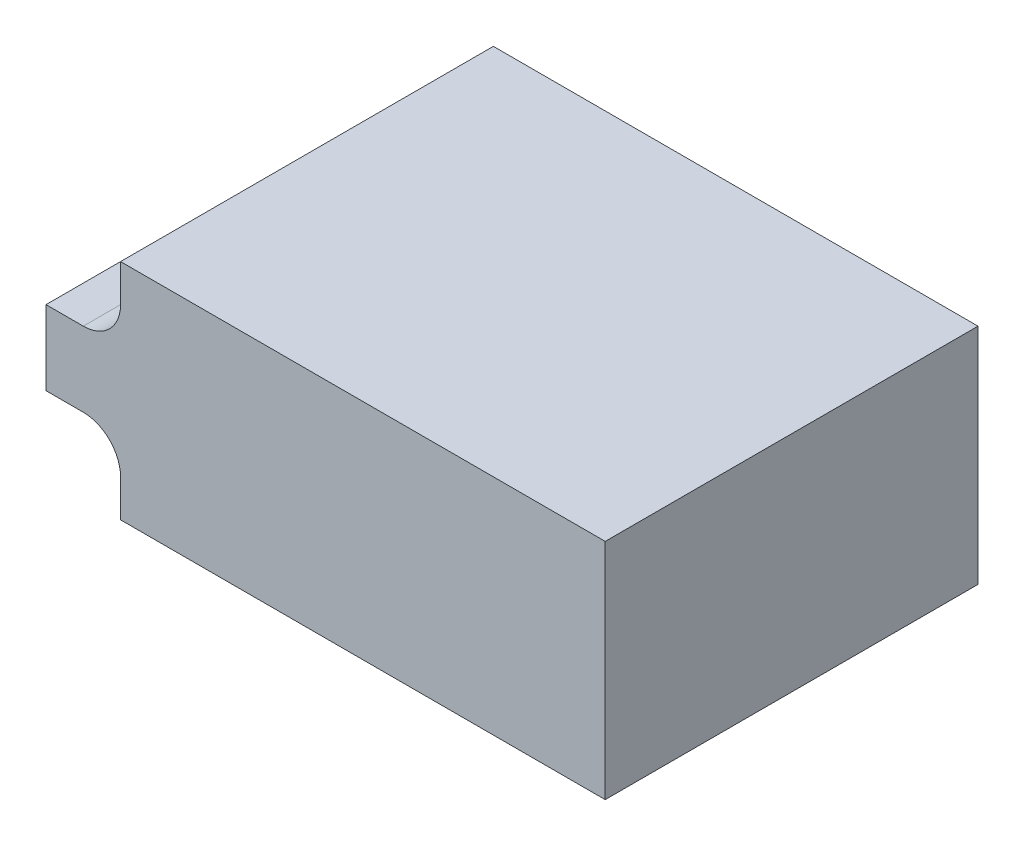
ISO-10303-21;
HEADER;
FILE_DESCRIPTION(('STEP AP214'),'2;1');
FILE_NAME('part.step','',(''),(''),'','','');
FILE_SCHEMA(('AUTOMOTIVE_DESIGN { 1 0 10303 214 1 1 1 1 }'));
ENDSEC;
DATA;
#1=APPLICATION_CONTEXT('core data for automotive mechanical design processes');
#2=APPLICATION_PROTOCOL_DEFINITION('international standard','automotive_design',2000,#1);
#3=PRODUCT_CONTEXT('',#1,'mechanical');
#4=PRODUCT('Part','Part','',(#3));
#5=PRODUCT_RELATED_PRODUCT_CATEGORY('part','',(#4));
#6=PRODUCT_DEFINITION_FORMATION('','',#4);
#7=PRODUCT_DEFINITION_CONTEXT('part definition',#1,'design');
#8=PRODUCT_DEFINITION('design','',#6,#7);
#9=PRODUCT_DEFINITION_SHAPE('','',#8);
#10=(LENGTH_UNIT() NAMED_UNIT(*) SI_UNIT(.MILLI.,.METRE.));
#11=(NAMED_UNIT(*) PLANE_ANGLE_UNIT() SI_UNIT($,.RADIAN.));
#12=(NAMED_UNIT(*) SI_UNIT($,.STERADIAN.) SOLID_ANGLE_UNIT());
#13=UNCERTAINTY_MEASURE_WITH_UNIT(LENGTH_MEASURE(1.E-05),#10,'distance_accuracy_value','');
#14=(GEOMETRIC_REPRESENTATION_CONTEXT(3) GLOBAL_UNCERTAINTY_ASSIGNED_CONTEXT((#13)) GLOBAL_UNIT_ASSIGNED_CONTEXT((#10,
#11,#12)) REPRESENTATION_CONTEXT('',''));
#15=CARTESIAN_POINT('',(0.,0.,0.));
#16=DIRECTION('',(0.,0.,1.));
#17=DIRECTION('',(1.,0.,0.));
#18=AXIS2_PLACEMENT_3D('',#15,#16,#17);
#19=CARTESIAN_POINT('',(7.5,3.,10.));
#20=DIRECTION('',(-1.,0.,0.));
#21=DIRECTION('',(0.,-1.,0.));
#22=AXIS2_PLACEMENT_3D('',#19,#20,#21);
#23=PLANE('',#22);
#24=DIRECTION('',(0.,1.,0.));
#25=VECTOR('',#24,1.);
#26=CARTESIAN_POINT('',(7.5,3.,0.));
#27=LINE('',#26,#25);
#28=CARTESIAN_POINT('',(7.5,-3.,0.));
#29=VERTEX_POINT('',#28);
#30=CARTESIAN_POINT('',(7.5,3.,0.));
#31=VERTEX_POINT('',#30);
#32=EDGE_CURVE('E152',#29,#31,#27,.T.);
#33=ORIENTED_EDGE('',*,*,#32,.T.);
#34=DIRECTION('',(0.,0.,-1.));
#35=VECTOR('',#34,1.);
#36=CARTESIAN_POINT('',(7.5,3.,10.));
#37=LINE('',#36,#35);
#38=CARTESIAN_POINT('',(7.5,3.,10.));
#39=VERTEX_POINT('',#38);
#40=EDGE_CURVE('E167',#39,#31,#37,.T.);
#41=ORIENTED_EDGE('',*,*,#40,.F.);
#42=DIRECTION('',(0.,1.,0.));
#43=VECTOR('',#42,1.);
#44=CARTESIAN_POINT('',(7.5,3.,10.));
#45=LINE('',#44,#43);
#46=CARTESIAN_POINT('',(7.5,-3.,10.));
#47=VERTEX_POINT('',#46);
#48=EDGE_CURVE('E135',#47,#39,#45,.T.);
#49=ORIENTED_EDGE('',*,*,#48,.F.);
#50=DIRECTION('',(0.,0.,-1.));
#51=VECTOR('',#50,1.);
#52=CARTESIAN_POINT('',(7.5,-3.,10.));
#53=LINE('',#52,#51);
#54=EDGE_CURVE('E151',#47,#29,#53,.T.);
#55=ORIENTED_EDGE('',*,*,#54,.T.);
#56=EDGE_LOOP('',(#33,#41,#49,#55));
#57=FACE_BOUND('',#56,.T.);
#58=ADVANCED_FACE('F38',(#57),#23,.F.);
#59=CARTESIAN_POINT('',(-7.5,3.,10.));
#60=DIRECTION('',(0.,-1.,0.));
#61=DIRECTION('',(0.,0.,-1.));
#62=AXIS2_PLACEMENT_3D('',#59,#60,#61);
#63=PLANE('',#62);
#64=DIRECTION('',(-1.,0.,0.));
#65=VECTOR('',#64,1.);
#66=CARTESIAN_POINT('',(-7.5,3.,0.));
#67=LINE('',#66,#65);
#68=CARTESIAN_POINT('',(-5.5,3.,0.));
#69=VERTEX_POINT('',#68);
#70=EDGE_CURVE('E129',#31,#69,#67,.T.);
#71=ORIENTED_EDGE('',*,*,#70,.T.);
#72=DIRECTION('',(0.,0.,-1.));
#73=VECTOR('',#72,1.);
#74=CARTESIAN_POINT('',(-5.5,3.,10.));
#75=LINE('',#74,#73);
#76=CARTESIAN_POINT('',(-5.5,3.,10.));
#77=VERTEX_POINT('',#76);
#78=EDGE_CURVE('E115',#77,#69,#75,.T.);
#79=ORIENTED_EDGE('',*,*,#78,.F.);
#80=DIRECTION('',(-1.,0.,0.));
#81=VECTOR('',#80,1.);
#82=CARTESIAN_POINT('',(-7.5,3.,10.));
#83=LINE('',#82,#81);
#84=EDGE_CURVE('E127',#39,#77,#83,.T.);
#85=ORIENTED_EDGE('',*,*,#84,.F.);
#86=ORIENTED_EDGE('',*,*,#40,.T.);
#87=EDGE_LOOP('',(#71,#79,#85,#86));
#88=FACE_BOUND('',#87,.T.);
#89=ADVANCED_FACE('F125',(#88),#63,.F.);
#90=CARTESIAN_POINT('',(-7.5,3.,10.));
#91=DIRECTION('',(1.,0.,0.));
#92=DIRECTION('',(0.,1.,0.));
#93=AXIS2_PLACEMENT_3D('',#90,#91,#92);
#94=PLANE('',#93);
#95=DIRECTION('',(0.,-1.,0.));
#96=VECTOR('',#95,1.);
#97=CARTESIAN_POINT('',(-7.5,3.,10.));
#98=LINE('',#97,#96);
#99=CARTESIAN_POINT('',(-7.5,0.999999999999999,10.));
#100=VERTEX_POINT('',#99);
#101=CARTESIAN_POINT('',(-7.5,-1.,10.));
#102=VERTEX_POINT('',#101);
#103=EDGE_CURVE('E138',#100,#102,#98,.T.);
#104=ORIENTED_EDGE('',*,*,#103,.F.);
#105=DIRECTION('',(0.,0.,-1.));
#106=VECTOR('',#105,1.);
#107=CARTESIAN_POINT('',(-7.5,0.999999999999999,10.));
#108=LINE('',#107,#106);
#109=CARTESIAN_POINT('',(-7.5,0.999999999999999,0.));
#110=VERTEX_POINT('',#109);
#111=EDGE_CURVE('E131',#100,#110,#108,.T.);
#112=ORIENTED_EDGE('',*,*,#111,.T.);
#113=DIRECTION('',(0.,-1.,0.));
#114=VECTOR('',#113,1.);
#115=CARTESIAN_POINT('',(-7.5,3.,0.));
#116=LINE('',#115,#114);
#117=CARTESIAN_POINT('',(-7.5,-1.,0.));
#118=VERTEX_POINT('',#117);
#119=EDGE_CURVE('E158',#110,#118,#116,.T.);
#120=ORIENTED_EDGE('',*,*,#119,.T.);
#121=DIRECTION('',(0.,0.,-1.));
#122=VECTOR('',#121,1.);
#123=CARTESIAN_POINT('',(-7.5,-1.,10.));
#124=LINE('',#123,#122);
#125=EDGE_CURVE('E205',#102,#118,#124,.T.);
#126=ORIENTED_EDGE('',*,*,#125,.F.);
#127=EDGE_LOOP('',(#104,#112,#120,#126));
#128=FACE_BOUND('',#127,.T.);
#129=ADVANCED_FACE('F244',(#128),#94,.F.);
#130=CARTESIAN_POINT('',(-7.5,-3.,10.));
#131=DIRECTION('',(0.,1.,0.));
#132=DIRECTION('',(0.,0.,1.));
#133=AXIS2_PLACEMENT_3D('',#130,#131,#132);
#134=PLANE('',#133);
#135=DIRECTION('',(1.,0.,0.));
#136=VECTOR('',#135,1.);
#137=CARTESIAN_POINT('',(-7.5,-3.,10.));
#138=LINE('',#137,#136);
#139=CARTESIAN_POINT('',(-5.5,-3.,10.));
#140=VERTEX_POINT('',#139);
#141=EDGE_CURVE('E143',#140,#47,#138,.T.);
#142=ORIENTED_EDGE('',*,*,#141,.F.);
#143=DIRECTION('',(0.,0.,-1.));
#144=VECTOR('',#143,1.);
#145=CARTESIAN_POINT('',(-5.5,-3.,10.));
#146=LINE('',#145,#144);
#147=CARTESIAN_POINT('',(-5.5,-3.,0.));
#148=VERTEX_POINT('',#147);
#149=EDGE_CURVE('E202',#140,#148,#146,.T.);
#150=ORIENTED_EDGE('',*,*,#149,.T.);
#151=DIRECTION('',(1.,0.,0.));
#152=VECTOR('',#151,1.);
#153=CARTESIAN_POINT('',(-7.5,-3.,0.));
#154=LINE('',#153,#152);
#155=EDGE_CURVE('E145',#148,#29,#154,.T.);
#156=ORIENTED_EDGE('',*,*,#155,.T.);
#157=ORIENTED_EDGE('',*,*,#54,.F.);
#158=EDGE_LOOP('',(#142,#150,#156,#157));
#159=FACE_BOUND('',#158,.T.);
#160=ADVANCED_FACE('F246',(#159),#134,.F.);
#161=CARTESIAN_POINT('',(0.,0.,10.));
#162=DIRECTION('',(0.,0.,1.));
#163=DIRECTION('',(1.,0.,0.));
#164=AXIS2_PLACEMENT_3D('',#161,#162,#163);
#165=PLANE('',#164);
#166=DIRECTION('',(0.,-1.,0.));
#167=VECTOR('',#166,1.);
#168=CARTESIAN_POINT('',(-5.5,3.,10.));
#169=LINE('',#168,#167);
#170=CARTESIAN_POINT('',(-5.5,2.,10.));
#171=VERTEX_POINT('',#170);
#172=EDGE_CURVE('E112',#77,#171,#169,.T.);
#173=ORIENTED_EDGE('',*,*,#172,.T.);
#174=CARTESIAN_POINT('',(-6.5,2.,10.));
#175=DIRECTION('',(0.,0.,1.));
#176=DIRECTION('',(1.,0.,0.));
#177=AXIS2_PLACEMENT_3D('',#174,#175,#176);
#178=CIRCLE('',#177,1.);
#179=CARTESIAN_POINT('',(-6.5,0.999999999999999,10.));
#180=VERTEX_POINT('',#179);
#181=EDGE_CURVE('E11',#171,#180,#178,.F.);
#182=ORIENTED_EDGE('',*,*,#181,.T.);
#183=DIRECTION('',(-1.,0.,0.));
#184=VECTOR('',#183,1.);
#185=CARTESIAN_POINT('',(-7.5,0.999999999999999,10.));
#186=LINE('',#185,#184);
#187=EDGE_CURVE('E120',#180,#100,#186,.T.);
#188=ORIENTED_EDGE('',*,*,#187,.T.);
#189=ORIENTED_EDGE('',*,*,#103,.T.);
#190=DIRECTION('',(1.,0.,0.));
#191=VECTOR('',#190,1.);
#192=CARTESIAN_POINT('',(-7.5,-1.,10.));
#193=LINE('',#192,#191);
#194=CARTESIAN_POINT('',(-6.5,-1.,10.));
#195=VERTEX_POINT('',#194);
#196=EDGE_CURVE('E194',#102,#195,#193,.T.);
#197=ORIENTED_EDGE('',*,*,#196,.T.);
#198=CARTESIAN_POINT('',(-6.5,-2.,10.));
#199=DIRECTION('',(0.,0.,1.));
#200=DIRECTION('',(1.,0.,0.));
#201=AXIS2_PLACEMENT_3D('',#198,#199,#200);
#202=CIRCLE('',#201,1.);
#203=CARTESIAN_POINT('',(-5.5,-2.,10.));
#204=VERTEX_POINT('',#203);
#205=EDGE_CURVE('E186',#195,#204,#202,.F.);
#206=ORIENTED_EDGE('',*,*,#205,.T.);
#207=DIRECTION('',(0.,-1.,0.));
#208=VECTOR('',#207,1.);
#209=CARTESIAN_POINT('',(-5.5,-3.,10.));
#210=LINE('',#209,#208);
#211=EDGE_CURVE('E192',#204,#140,#210,.T.);
#212=ORIENTED_EDGE('',*,*,#211,.T.);
#213=ORIENTED_EDGE('',*,*,#141,.T.);
#214=ORIENTED_EDGE('',*,*,#48,.T.);
#215=ORIENTED_EDGE('',*,*,#84,.T.);
#216=EDGE_LOOP('',(#173,#182,#188,#189,#197,#206,#212,#213,#214,#215));
#217=FACE_BOUND('',#216,.T.);
#218=ADVANCED_FACE('F133',(#217),#165,.T.);
#219=CARTESIAN_POINT('',(0.,0.,0.));
#220=DIRECTION('',(0.,0.,1.));
#221=DIRECTION('',(1.,0.,0.));
#222=AXIS2_PLACEMENT_3D('',#219,#220,#221);
#223=PLANE('',#222);
#224=ORIENTED_EDGE('',*,*,#119,.F.);
#225=DIRECTION('',(-1.,0.,0.));
#226=VECTOR('',#225,1.);
#227=CARTESIAN_POINT('',(-7.5,0.999999999999999,0.));
#228=LINE('',#227,#226);
#229=CARTESIAN_POINT('',(-6.5,0.999999999999999,0.));
#230=VERTEX_POINT('',#229);
#231=EDGE_CURVE('E121',#230,#110,#228,.T.);
#232=ORIENTED_EDGE('',*,*,#231,.F.);
#233=CARTESIAN_POINT('',(-6.5,2.,0.));
#234=DIRECTION('',(0.,0.,1.));
#235=DIRECTION('',(1.,0.,0.));
#236=AXIS2_PLACEMENT_3D('',#233,#234,#235);
#237=CIRCLE('',#236,1.);
#238=CARTESIAN_POINT('',(-5.5,2.,0.));
#239=VERTEX_POINT('',#238);
#240=EDGE_CURVE('E47',#230,#239,#237,.T.);
#241=ORIENTED_EDGE('',*,*,#240,.T.);
#242=DIRECTION('',(0.,-1.,0.));
#243=VECTOR('',#242,1.);
#244=CARTESIAN_POINT('',(-5.5,3.,0.));
#245=LINE('',#244,#243);
#246=EDGE_CURVE('E225',#69,#239,#245,.T.);
#247=ORIENTED_EDGE('',*,*,#246,.F.);
#248=ORIENTED_EDGE('',*,*,#70,.F.);
#249=ORIENTED_EDGE('',*,*,#32,.F.);
#250=ORIENTED_EDGE('',*,*,#155,.F.);
#251=DIRECTION('',(0.,-1.,0.));
#252=VECTOR('',#251,1.);
#253=CARTESIAN_POINT('',(-5.5,-3.,0.));
#254=LINE('',#253,#252);
#255=CARTESIAN_POINT('',(-5.5,-2.,0.));
#256=VERTEX_POINT('',#255);
#257=EDGE_CURVE('E214',#256,#148,#254,.T.);
#258=ORIENTED_EDGE('',*,*,#257,.F.);
#259=CARTESIAN_POINT('',(-6.5,-2.,0.));
#260=DIRECTION('',(0.,0.,1.));
#261=DIRECTION('',(1.,0.,0.));
#262=AXIS2_PLACEMENT_3D('',#259,#260,#261);
#263=CIRCLE('',#262,1.);
#264=CARTESIAN_POINT('',(-6.5,-1.,0.));
#265=VERTEX_POINT('',#264);
#266=EDGE_CURVE('E183',#256,#265,#263,.T.);
#267=ORIENTED_EDGE('',*,*,#266,.T.);
#268=DIRECTION('',(1.,0.,0.));
#269=VECTOR('',#268,1.);
#270=CARTESIAN_POINT('',(-7.5,-1.,0.));
#271=LINE('',#270,#269);
#272=EDGE_CURVE('E212',#118,#265,#271,.T.);
#273=ORIENTED_EDGE('',*,*,#272,.F.);
#274=EDGE_LOOP('',(#224,#232,#241,#247,#248,#249,#250,#258,#267,#273));
#275=FACE_BOUND('',#274,.T.);
#276=ADVANCED_FACE('F211',(#275),#223,.F.);
#277=CARTESIAN_POINT('',(-5.5,-3.,10.));
#278=DIRECTION('',(1.,0.,0.));
#279=DIRECTION('',(0.,0.,-1.));
#280=AXIS2_PLACEMENT_3D('',#277,#278,#279);
#281=PLANE('',#280);
#282=ORIENTED_EDGE('',*,*,#211,.F.);
#283=DIRECTION('',(0.,0.,-1.));
#284=VECTOR('',#283,1.);
#285=CARTESIAN_POINT('',(-5.5,-2.,0.));
#286=LINE('',#285,#284);
#287=EDGE_CURVE('E170',#204,#256,#286,.T.);
#288=ORIENTED_EDGE('',*,*,#287,.T.);
#289=ORIENTED_EDGE('',*,*,#257,.T.);
#290=ORIENTED_EDGE('',*,*,#149,.F.);
#291=EDGE_LOOP('',(#282,#288,#289,#290));
#292=FACE_BOUND('',#291,.T.);
#293=ADVANCED_FACE('F199',(#292),#281,.F.);
#294=CARTESIAN_POINT('',(-7.5,-1.,10.));
#295=DIRECTION('',(0.,1.,0.));
#296=DIRECTION('',(-1.,0.,0.));
#297=AXIS2_PLACEMENT_3D('',#294,#295,#296);
#298=PLANE('',#297);
#299=ORIENTED_EDGE('',*,*,#272,.T.);
#300=DIRECTION('',(0.,0.,-1.));
#301=VECTOR('',#300,1.);
#302=CARTESIAN_POINT('',(-6.5,-1.,10.));
#303=LINE('',#302,#301);
#304=EDGE_CURVE('E174',#265,#195,#303,.F.);
#305=ORIENTED_EDGE('',*,*,#304,.T.);
#306=ORIENTED_EDGE('',*,*,#196,.F.);
#307=ORIENTED_EDGE('',*,*,#125,.T.);
#308=EDGE_LOOP('',(#299,#305,#306,#307));
#309=FACE_BOUND('',#308,.T.);
#310=ADVANCED_FACE('F216',(#309),#298,.F.);
#311=CARTESIAN_POINT('',(-7.5,0.999999999999999,10.));
#312=DIRECTION('',(0.,-1.,0.));
#313=DIRECTION('',(1.,0.,0.));
#314=AXIS2_PLACEMENT_3D('',#311,#312,#313);
#315=PLANE('',#314);
#316=ORIENTED_EDGE('',*,*,#187,.F.);
#317=DIRECTION('',(0.,0.,-1.));
#318=VECTOR('',#317,1.);
#319=CARTESIAN_POINT('',(-6.5,0.999999999999999,0.));
#320=LINE('',#319,#318);
#321=EDGE_CURVE('E177',#180,#230,#320,.T.);
#322=ORIENTED_EDGE('',*,*,#321,.T.);
#323=ORIENTED_EDGE('',*,*,#231,.T.);
#324=ORIENTED_EDGE('',*,*,#111,.F.);
#325=EDGE_LOOP('',(#316,#322,#323,#324));
#326=FACE_BOUND('',#325,.T.);
#327=ADVANCED_FACE('F242',(#326),#315,.F.);
#328=CARTESIAN_POINT('',(-5.5,3.,10.));
#329=DIRECTION('',(1.,0.,0.));
#330=DIRECTION('',(0.,1.,0.));
#331=AXIS2_PLACEMENT_3D('',#328,#329,#330);
#332=PLANE('',#331);
#333=ORIENTED_EDGE('',*,*,#246,.T.);
#334=DIRECTION('',(0.,0.,-1.));
#335=VECTOR('',#334,1.);
#336=CARTESIAN_POINT('',(-5.5,2.,10.));
#337=LINE('',#336,#335);
#338=EDGE_CURVE('E54',#239,#171,#337,.F.);
#339=ORIENTED_EDGE('',*,*,#338,.T.);
#340=ORIENTED_EDGE('',*,*,#172,.F.);
#341=ORIENTED_EDGE('',*,*,#78,.T.);
#342=EDGE_LOOP('',(#333,#339,#340,#341));
#343=FACE_BOUND('',#342,.T.);
#344=ADVANCED_FACE('F114',(#343),#332,.F.);
#345=CARTESIAN_POINT('',(-6.5,-2.,10.));
#346=DIRECTION('',(0.,0.,1.));
#347=DIRECTION('',(1.,0.,0.));
#348=AXIS2_PLACEMENT_3D('',#345,#346,#347);
#349=CYLINDRICAL_SURFACE('',#348,1.);
#350=ORIENTED_EDGE('',*,*,#205,.F.);
#351=ORIENTED_EDGE('',*,*,#304,.F.);
#352=ORIENTED_EDGE('',*,*,#266,.F.);
#353=ORIENTED_EDGE('',*,*,#287,.F.);
#354=EDGE_LOOP('',(#350,#351,#352,#353));
#355=FACE_BOUND('',#354,.T.);
#356=ADVANCED_FACE('F207',(#355),#349,.F.);
#357=CARTESIAN_POINT('',(-6.5,2.,10.));
#358=DIRECTION('',(0.,0.,1.));
#359=DIRECTION('',(1.,0.,0.));
#360=AXIS2_PLACEMENT_3D('',#357,#358,#359);
#361=CYLINDRICAL_SURFACE('',#360,1.);
#362=ORIENTED_EDGE('',*,*,#181,.F.);
#363=ORIENTED_EDGE('',*,*,#338,.F.);
#364=ORIENTED_EDGE('',*,*,#240,.F.);
#365=ORIENTED_EDGE('',*,*,#321,.F.);
#366=EDGE_LOOP('',(#362,#363,#364,#365));
#367=FACE_BOUND('',#366,.T.);
#368=ADVANCED_FACE('F40',(#367),#361,.F.);
#369=CLOSED_SHELL('',(#58,#89,#129,#160,#218,#276,#293,#310,#327,#344,#356,#368));
#370=MANIFOLD_SOLID_BREP('B2',#369);
#371=ADVANCED_BREP_SHAPE_REPRESENTATION('',(#18,#370),#14);
#372=SHAPE_DEFINITION_REPRESENTATION(#9,#371);
ENDSEC;
END-ISO-10303-21;
